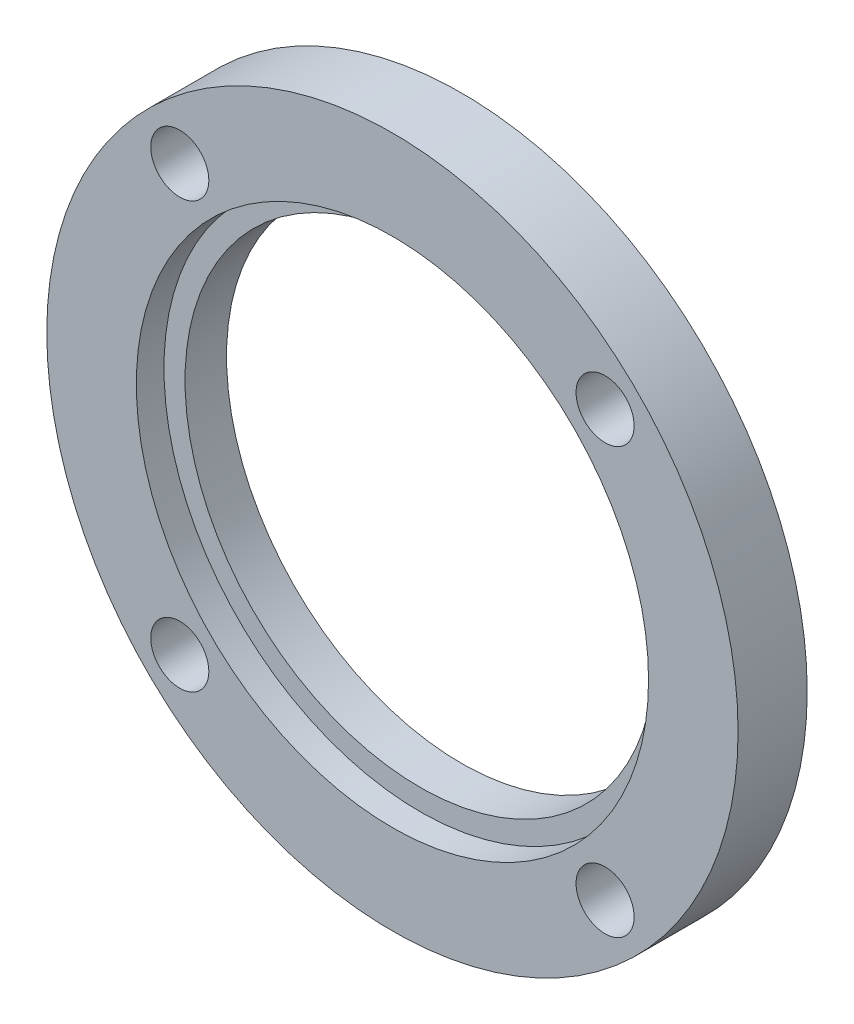
ISO-10303-21;
HEADER;
FILE_DESCRIPTION(('STEP AP214'),'2;1');
FILE_NAME('part.step','',(''),(''),'','','');
FILE_SCHEMA(('AUTOMOTIVE_DESIGN { 1 0 10303 214 1 1 1 1 }'));
ENDSEC;
DATA;
#1=APPLICATION_CONTEXT('core data for automotive mechanical design processes');
#2=APPLICATION_PROTOCOL_DEFINITION('international standard','automotive_design',2000,#1);
#3=PRODUCT_CONTEXT('',#1,'mechanical');
#4=PRODUCT('Part','Part','',(#3));
#5=PRODUCT_RELATED_PRODUCT_CATEGORY('part','',(#4));
#6=PRODUCT_DEFINITION_FORMATION('','',#4);
#7=PRODUCT_DEFINITION_CONTEXT('part definition',#1,'design');
#8=PRODUCT_DEFINITION('design','',#6,#7);
#9=PRODUCT_DEFINITION_SHAPE('','',#8);
#10=(LENGTH_UNIT() NAMED_UNIT(*) SI_UNIT(.MILLI.,.METRE.));
#11=(NAMED_UNIT(*) PLANE_ANGLE_UNIT() SI_UNIT($,.RADIAN.));
#12=(NAMED_UNIT(*) SI_UNIT($,.STERADIAN.) SOLID_ANGLE_UNIT());
#13=UNCERTAINTY_MEASURE_WITH_UNIT(LENGTH_MEASURE(1.E-05),#10,'distance_accuracy_value','');
#14=(GEOMETRIC_REPRESENTATION_CONTEXT(3) GLOBAL_UNCERTAINTY_ASSIGNED_CONTEXT((#13)) GLOBAL_UNIT_ASSIGNED_CONTEXT((#10,
#11,#12)) REPRESENTATION_CONTEXT('',''));
#15=CARTESIAN_POINT('',(0.,0.,0.));
#16=DIRECTION('',(0.,0.,1.));
#17=DIRECTION('',(1.,0.,0.));
#18=AXIS2_PLACEMENT_3D('',#15,#16,#17);
#19=CARTESIAN_POINT('',(0.,0.,5.));
#20=DIRECTION('',(0.,0.,-1.));
#21=DIRECTION('',(-1.,0.,0.));
#22=AXIS2_PLACEMENT_3D('',#19,#20,#21);
#23=CYLINDRICAL_SURFACE('',#22,25.);
#24=CARTESIAN_POINT('',(0.,0.,5.));
#25=DIRECTION('',(0.,0.,1.));
#26=DIRECTION('',(1.,0.,0.));
#27=AXIS2_PLACEMENT_3D('',#24,#25,#26);
#28=CIRCLE('',#27,25.);
#29=CARTESIAN_POINT('',(25.,0.,5.));
#30=VERTEX_POINT('',#29);
#31=EDGE_CURVE('E10',#30,#30,#28,.T.);
#32=ORIENTED_EDGE('',*,*,#31,.F.);
#33=EDGE_LOOP('',(#32));
#34=FACE_BOUND('',#33,.T.);
#35=CARTESIAN_POINT('',(0.,0.,0.));
#36=DIRECTION('',(0.,0.,1.));
#37=DIRECTION('',(1.,0.,0.));
#38=AXIS2_PLACEMENT_3D('',#35,#36,#37);
#39=CIRCLE('',#38,25.);
#40=CARTESIAN_POINT('',(25.,0.,0.));
#41=VERTEX_POINT('',#40);
#42=EDGE_CURVE('E34',#41,#41,#39,.T.);
#43=ORIENTED_EDGE('',*,*,#42,.T.);
#44=EDGE_LOOP('',(#43));
#45=FACE_BOUND('',#44,.T.);
#46=ADVANCED_FACE('F31',(#34,#45),#23,.T.);
#47=CARTESIAN_POINT('',(0.,0.,5.));
#48=DIRECTION('',(0.,0.,1.));
#49=DIRECTION('',(1.,0.,0.));
#50=AXIS2_PLACEMENT_3D('',#47,#48,#49);
#51=PLANE('',#50);
#52=CARTESIAN_POINT('',(-15.3795724908074,15.3795724908074,5.));
#53=DIRECTION('',(0.,0.,1.));
#54=DIRECTION('',(1.,0.,0.));
#55=AXIS2_PLACEMENT_3D('',#52,#53,#54);
#56=CIRCLE('',#55,2.1);
#57=CARTESIAN_POINT('',(-13.2795724908074,15.3795724908074,5.));
#58=VERTEX_POINT('',#57);
#59=EDGE_CURVE('E65',#58,#58,#56,.T.);
#60=ORIENTED_EDGE('',*,*,#59,.F.);
#61=EDGE_LOOP('',(#60));
#62=FACE_BOUND('',#61,.T.);
#63=CARTESIAN_POINT('',(-15.3795724908074,-15.3795724908074,5.));
#64=DIRECTION('',(0.,0.,1.));
#65=DIRECTION('',(1.,0.,0.));
#66=AXIS2_PLACEMENT_3D('',#63,#64,#65);
#67=CIRCLE('',#66,2.1);
#68=CARTESIAN_POINT('',(-13.2795724908074,-15.3795724908074,5.));
#69=VERTEX_POINT('',#68);
#70=EDGE_CURVE('E64',#69,#69,#67,.T.);
#71=ORIENTED_EDGE('',*,*,#70,.F.);
#72=EDGE_LOOP('',(#71));
#73=FACE_BOUND('',#72,.T.);
#74=CARTESIAN_POINT('',(15.3795724908074,-15.3795724908074,5.));
#75=DIRECTION('',(0.,0.,1.));
#76=DIRECTION('',(1.,0.,0.));
#77=AXIS2_PLACEMENT_3D('',#74,#75,#76);
#78=CIRCLE('',#77,2.1);
#79=CARTESIAN_POINT('',(17.4795724908074,-15.3795724908074,5.));
#80=VERTEX_POINT('',#79);
#81=EDGE_CURVE('E71',#80,#80,#78,.T.);
#82=ORIENTED_EDGE('',*,*,#81,.F.);
#83=EDGE_LOOP('',(#82));
#84=FACE_BOUND('',#83,.T.);
#85=CARTESIAN_POINT('',(15.3795724908074,15.3795724908074,5.));
#86=DIRECTION('',(0.,0.,1.));
#87=DIRECTION('',(1.,0.,0.));
#88=AXIS2_PLACEMENT_3D('',#85,#86,#87);
#89=CIRCLE('',#88,2.1);
#90=CARTESIAN_POINT('',(17.4795724908074,15.3795724908074,5.));
#91=VERTEX_POINT('',#90);
#92=EDGE_CURVE('E57',#91,#91,#89,.T.);
#93=ORIENTED_EDGE('',*,*,#92,.F.);
#94=EDGE_LOOP('',(#93));
#95=FACE_BOUND('',#94,.T.);
#96=CARTESIAN_POINT('',(0.,0.,5.));
#97=DIRECTION('',(0.,0.,1.));
#98=DIRECTION('',(1.,0.,0.));
#99=AXIS2_PLACEMENT_3D('',#96,#97,#98);
#100=CIRCLE('',#99,18.525);
#101=CARTESIAN_POINT('',(18.525,0.,5.));
#102=VERTEX_POINT('',#101);
#103=EDGE_CURVE('E43',#102,#102,#100,.T.);
#104=ORIENTED_EDGE('',*,*,#103,.F.);
#105=EDGE_LOOP('',(#104));
#106=FACE_BOUND('',#105,.T.);
#107=ORIENTED_EDGE('',*,*,#31,.T.);
#108=EDGE_LOOP('',(#107));
#109=FACE_BOUND('',#108,.T.);
#110=ADVANCED_FACE('F81',(#62,#73,#84,#95,#106,#109),#51,.T.);
#111=CARTESIAN_POINT('',(0.,0.,0.));
#112=DIRECTION('',(0.,0.,1.));
#113=DIRECTION('',(1.,0.,0.));
#114=AXIS2_PLACEMENT_3D('',#111,#112,#113);
#115=PLANE('',#114);
#116=CARTESIAN_POINT('',(-15.3795724908074,15.3795724908074,0.));
#117=DIRECTION('',(0.,0.,1.));
#118=DIRECTION('',(1.,0.,0.));
#119=AXIS2_PLACEMENT_3D('',#116,#117,#118);
#120=CIRCLE('',#119,2.1);
#121=CARTESIAN_POINT('',(-13.2795724908074,15.3795724908074,0.));
#122=VERTEX_POINT('',#121);
#123=EDGE_CURVE('E61',#122,#122,#120,.F.);
#124=ORIENTED_EDGE('',*,*,#123,.F.);
#125=EDGE_LOOP('',(#124));
#126=FACE_BOUND('',#125,.T.);
#127=CARTESIAN_POINT('',(-15.3795724908074,-15.3795724908074,0.));
#128=DIRECTION('',(0.,0.,1.));
#129=DIRECTION('',(1.,0.,0.));
#130=AXIS2_PLACEMENT_3D('',#127,#128,#129);
#131=CIRCLE('',#130,2.1);
#132=CARTESIAN_POINT('',(-13.2795724908074,-15.3795724908074,0.));
#133=VERTEX_POINT('',#132);
#134=EDGE_CURVE('E68',#133,#133,#131,.F.);
#135=ORIENTED_EDGE('',*,*,#134,.F.);
#136=EDGE_LOOP('',(#135));
#137=FACE_BOUND('',#136,.T.);
#138=CARTESIAN_POINT('',(15.3795724908074,-15.3795724908074,0.));
#139=DIRECTION('',(0.,0.,1.));
#140=DIRECTION('',(1.,0.,0.));
#141=AXIS2_PLACEMENT_3D('',#138,#139,#140);
#142=CIRCLE('',#141,2.1);
#143=CARTESIAN_POINT('',(17.4795724908074,-15.3795724908074,0.));
#144=VERTEX_POINT('',#143);
#145=EDGE_CURVE('E60',#144,#144,#142,.F.);
#146=ORIENTED_EDGE('',*,*,#145,.F.);
#147=EDGE_LOOP('',(#146));
#148=FACE_BOUND('',#147,.T.);
#149=CARTESIAN_POINT('',(15.3795724908074,15.3795724908074,0.));
#150=DIRECTION('',(0.,0.,1.));
#151=DIRECTION('',(1.,0.,0.));
#152=AXIS2_PLACEMENT_3D('',#149,#150,#151);
#153=CIRCLE('',#152,2.1);
#154=CARTESIAN_POINT('',(17.4795724908074,15.3795724908074,0.));
#155=VERTEX_POINT('',#154);
#156=EDGE_CURVE('E54',#155,#155,#153,.F.);
#157=ORIENTED_EDGE('',*,*,#156,.F.);
#158=EDGE_LOOP('',(#157));
#159=FACE_BOUND('',#158,.T.);
#160=CARTESIAN_POINT('',(0.,0.,0.));
#161=DIRECTION('',(0.,0.,1.));
#162=DIRECTION('',(1.,0.,0.));
#163=AXIS2_PLACEMENT_3D('',#160,#161,#162);
#164=CIRCLE('',#163,17.);
#165=CARTESIAN_POINT('',(17.,0.,0.));
#166=VERTEX_POINT('',#165);
#167=EDGE_CURVE('E46',#166,#166,#164,.F.);
#168=ORIENTED_EDGE('',*,*,#167,.F.);
#169=EDGE_LOOP('',(#168));
#170=FACE_BOUND('',#169,.T.);
#171=ORIENTED_EDGE('',*,*,#42,.F.);
#172=EDGE_LOOP('',(#171));
#173=FACE_BOUND('',#172,.T.);
#174=ADVANCED_FACE('F84',(#126,#137,#148,#159,#170,#173),#115,.F.);
#175=CARTESIAN_POINT('',(0.,0.,3.));
#176=DIRECTION('',(0.,0.,1.));
#177=DIRECTION('',(1.,0.,0.));
#178=AXIS2_PLACEMENT_3D('',#175,#176,#177);
#179=CYLINDRICAL_SURFACE('',#178,18.525);
#180=CARTESIAN_POINT('',(0.,0.,3.));
#181=DIRECTION('',(0.,0.,1.));
#182=DIRECTION('',(1.,0.,0.));
#183=AXIS2_PLACEMENT_3D('',#180,#181,#182);
#184=CIRCLE('',#183,18.525);
#185=CARTESIAN_POINT('',(18.525,0.,3.));
#186=VERTEX_POINT('',#185);
#187=EDGE_CURVE('E41',#186,#186,#184,.T.);
#188=ORIENTED_EDGE('',*,*,#187,.F.);
#189=EDGE_LOOP('',(#188));
#190=FACE_BOUND('',#189,.T.);
#191=ORIENTED_EDGE('',*,*,#103,.T.);
#192=EDGE_LOOP('',(#191));
#193=FACE_BOUND('',#192,.T.);
#194=ADVANCED_FACE('F91',(#190,#193),#179,.F.);
#195=CARTESIAN_POINT('',(0.,0.,3.));
#196=DIRECTION('',(0.,0.,1.));
#197=DIRECTION('',(1.,0.,0.));
#198=AXIS2_PLACEMENT_3D('',#195,#196,#197);
#199=PLANE('',#198);
#200=CARTESIAN_POINT('',(0.,0.,3.));
#201=DIRECTION('',(0.,0.,1.));
#202=DIRECTION('',(1.,0.,0.));
#203=AXIS2_PLACEMENT_3D('',#200,#201,#202);
#204=CIRCLE('',#203,17.);
#205=CARTESIAN_POINT('',(17.,0.,3.));
#206=VERTEX_POINT('',#205);
#207=EDGE_CURVE('E51',#206,#206,#204,.T.);
#208=ORIENTED_EDGE('',*,*,#207,.F.);
#209=EDGE_LOOP('',(#208));
#210=FACE_BOUND('',#209,.T.);
#211=ORIENTED_EDGE('',*,*,#187,.T.);
#212=EDGE_LOOP('',(#211));
#213=FACE_BOUND('',#212,.T.);
#214=ADVANCED_FACE('F93',(#210,#213),#199,.T.);
#215=CARTESIAN_POINT('',(0.,0.,-48.0832611206852));
#216=DIRECTION('',(0.,0.,1.));
#217=DIRECTION('',(1.,0.,0.));
#218=AXIS2_PLACEMENT_3D('',#215,#216,#217);
#219=CYLINDRICAL_SURFACE('',#218,17.);
#220=ORIENTED_EDGE('',*,*,#167,.T.);
#221=EDGE_LOOP('',(#220));
#222=FACE_BOUND('',#221,.T.);
#223=ORIENTED_EDGE('',*,*,#207,.T.);
#224=EDGE_LOOP('',(#223));
#225=FACE_BOUND('',#224,.T.);
#226=ADVANCED_FACE('F100',(#222,#225),#219,.F.);
#227=CARTESIAN_POINT('',(15.3795724908074,15.3795724908074,-5.939696961967));
#228=DIRECTION('',(0.,0.,1.));
#229=DIRECTION('',(1.,0.,0.));
#230=AXIS2_PLACEMENT_3D('',#227,#228,#229);
#231=CYLINDRICAL_SURFACE('',#230,2.1);
#232=CARTESIAN_POINT('',(17.4795724908074,15.3795724908074,0.));
#233=CARTESIAN_POINT('',(17.4795724908074,15.3795724908074,0.0520833333333334));
#234=CARTESIAN_POINT('',(17.4795724908074,15.3795724908074,0.104166666666667));
#235=CARTESIAN_POINT('',(17.4795724908074,15.3795724908074,0.208333333333334));
#236=CARTESIAN_POINT('',(17.4795724908074,15.3795724908074,0.260416666666667));
#237=CARTESIAN_POINT('',(17.4795724908074,15.3795724908074,0.364583333333334));
#238=CARTESIAN_POINT('',(17.4795724908074,15.3795724908074,0.416666666666667));
#239=CARTESIAN_POINT('',(17.4795724908074,15.3795724908074,0.520833333333334));
#240=CARTESIAN_POINT('',(17.4795724908074,15.3795724908074,0.572916666666667));
#241=CARTESIAN_POINT('',(17.4795724908074,15.3795724908074,0.677083333333334));
#242=CARTESIAN_POINT('',(17.4795724908074,15.3795724908074,0.729166666666667));
#243=CARTESIAN_POINT('',(17.4795724908074,15.3795724908074,0.833333333333333));
#244=CARTESIAN_POINT('',(17.4795724908074,15.3795724908074,0.885416666666667));
#245=CARTESIAN_POINT('',(17.4795724908074,15.3795724908074,0.989583333333333));
#246=CARTESIAN_POINT('',(17.4795724908074,15.3795724908074,1.04166666666667));
#247=CARTESIAN_POINT('',(17.4795724908074,15.3795724908074,1.14583333333333));
#248=CARTESIAN_POINT('',(17.4795724908074,15.3795724908074,1.19791666666667));
#249=CARTESIAN_POINT('',(17.4795724908074,15.3795724908074,1.30208333333333));
#250=CARTESIAN_POINT('',(17.4795724908074,15.3795724908074,1.35416666666667));
#251=CARTESIAN_POINT('',(17.4795724908074,15.3795724908074,1.45833333333333));
#252=CARTESIAN_POINT('',(17.4795724908074,15.3795724908074,1.51041666666667));
#253=CARTESIAN_POINT('',(17.4795724908074,15.3795724908074,1.61458333333333));
#254=CARTESIAN_POINT('',(17.4795724908074,15.3795724908074,1.66666666666667));
#255=CARTESIAN_POINT('',(17.4795724908074,15.3795724908074,1.77083333333333));
#256=CARTESIAN_POINT('',(17.4795724908074,15.3795724908074,1.82291666666667));
#257=CARTESIAN_POINT('',(17.4795724908074,15.3795724908074,1.92708333333333));
#258=CARTESIAN_POINT('',(17.4795724908074,15.3795724908074,1.97916666666667));
#259=CARTESIAN_POINT('',(17.4795724908074,15.3795724908074,2.08333333333333));
#260=CARTESIAN_POINT('',(17.4795724908074,15.3795724908074,2.13541666666667));
#261=CARTESIAN_POINT('',(17.4795724908074,15.3795724908074,2.23958333333333));
#262=CARTESIAN_POINT('',(17.4795724908074,15.3795724908074,2.29166666666667));
#263=CARTESIAN_POINT('',(17.4795724908074,15.3795724908074,2.39583333333333));
#264=CARTESIAN_POINT('',(17.4795724908074,15.3795724908074,2.44791666666667));
#265=CARTESIAN_POINT('',(17.4795724908074,15.3795724908074,2.55208333333333));
#266=CARTESIAN_POINT('',(17.4795724908074,15.3795724908074,2.60416666666667));
#267=CARTESIAN_POINT('',(17.4795724908074,15.3795724908074,2.70833333333333));
#268=CARTESIAN_POINT('',(17.4795724908074,15.3795724908074,2.76041666666667));
#269=CARTESIAN_POINT('',(17.4795724908074,15.3795724908074,2.86458333333333));
#270=CARTESIAN_POINT('',(17.4795724908074,15.3795724908074,2.91666666666667));
#271=CARTESIAN_POINT('',(17.4795724908074,15.3795724908074,3.02083333333333));
#272=CARTESIAN_POINT('',(17.4795724908074,15.3795724908074,3.07291666666667));
#273=CARTESIAN_POINT('',(17.4795724908074,15.3795724908074,3.17708333333333));
#274=CARTESIAN_POINT('',(17.4795724908074,15.3795724908074,3.22916666666667));
#275=CARTESIAN_POINT('',(17.4795724908074,15.3795724908074,3.33333333333333));
#276=CARTESIAN_POINT('',(17.4795724908074,15.3795724908074,3.38541666666667));
#277=CARTESIAN_POINT('',(17.4795724908074,15.3795724908074,3.48958333333333));
#278=CARTESIAN_POINT('',(17.4795724908074,15.3795724908074,3.54166666666667));
#279=CARTESIAN_POINT('',(17.4795724908074,15.3795724908074,3.64583333333333));
#280=CARTESIAN_POINT('',(17.4795724908074,15.3795724908074,3.69791666666667));
#281=CARTESIAN_POINT('',(17.4795724908074,15.3795724908074,3.80208333333333));
#282=CARTESIAN_POINT('',(17.4795724908074,15.3795724908074,3.85416666666667));
#283=CARTESIAN_POINT('',(17.4795724908074,15.3795724908074,3.95833333333333));
#284=CARTESIAN_POINT('',(17.4795724908074,15.3795724908074,4.01041666666667));
#285=CARTESIAN_POINT('',(17.4795724908074,15.3795724908074,4.11458333333333));
#286=CARTESIAN_POINT('',(17.4795724908074,15.3795724908074,4.16666666666667));
#287=CARTESIAN_POINT('',(17.4795724908074,15.3795724908074,4.27083333333333));
#288=CARTESIAN_POINT('',(17.4795724908074,15.3795724908074,4.32291666666667));
#289=CARTESIAN_POINT('',(17.4795724908074,15.3795724908074,4.42708333333333));
#290=CARTESIAN_POINT('',(17.4795724908074,15.3795724908074,4.47916666666667));
#291=CARTESIAN_POINT('',(17.4795724908074,15.3795724908074,4.58333333333333));
#292=CARTESIAN_POINT('',(17.4795724908074,15.3795724908074,4.63541666666667));
#293=CARTESIAN_POINT('',(17.4795724908074,15.3795724908074,4.73958333333333));
#294=CARTESIAN_POINT('',(17.4795724908074,15.3795724908074,4.79166666666667));
#295=CARTESIAN_POINT('',(17.4795724908074,15.3795724908074,4.89583333333333));
#296=CARTESIAN_POINT('',(17.4795724908074,15.3795724908074,4.94791666666667));
#297=CARTESIAN_POINT('',(17.4795724908074,15.3795724908074,5.));
#298=B_SPLINE_CURVE_WITH_KNOTS('',3,(#232,#233,#234,#235,#236,#237,#238,#239,#240,#241,#242,
#243,#244,#245,#246,#247,#248,#249,#250,#251,#252,#253,#254,#255,#256,#257,#258,#259,#260,#261,
#262,#263,#264,#265,#266,#267,#268,#269,#270,#271,#272,#273,#274,#275,#276,#277,#278,#279,#280,
#281,#282,#283,#284,#285,#286,#287,#288,#289,#290,#291,#292,#293,#294,#295,#296,#297),
.UNSPECIFIED.,.F.,.F.,(4,2,2,2,2,2,2,2,2,2,2,2,2,2,2,2,2,2,2,2,2,2,2,2,2,2,2,2,2,2,2,2,4),(0.,
0.15625,0.3125,0.46875,0.625000000000001,0.78125,0.9375,1.09375,1.25,1.40625,1.5625,1.71875,
1.875,2.03125,2.1875,2.34375,2.5,2.65625,2.8125,2.96875,3.125,3.28125,3.4375,3.59375,3.75,
3.90625,4.0625,4.21875,4.375,4.53125,4.6875,4.84375,5.),.UNSPECIFIED.);
#299=EDGE_CURVE('BSEAM127',#155,#91,#298,.T.);
#300=ORIENTED_EDGE('',*,*,#156,.T.);
#301=ORIENTED_EDGE('',*,*,#92,.T.);
#302=ORIENTED_EDGE('',*,*,#299,.T.);
#303=ORIENTED_EDGE('',*,*,#299,.F.);
#304=EDGE_LOOP('',(#300,#302,#301,#303));
#305=FACE_BOUND('',#304,.T.);
#306=ADVANCED_FACE('F127',(#305),#231,.F.);
#307=CARTESIAN_POINT('',(15.3795724908074,-15.3795724908074,-5.939696961967));
#308=DIRECTION('',(0.,0.,1.));
#309=DIRECTION('',(1.,0.,0.));
#310=AXIS2_PLACEMENT_3D('',#307,#308,#309);
#311=CYLINDRICAL_SURFACE('',#310,2.1);
#312=CARTESIAN_POINT('',(17.4795724908074,-15.3795724908074,0.));
#313=CARTESIAN_POINT('',(17.4795724908074,-15.3795724908074,0.0520833333333334));
#314=CARTESIAN_POINT('',(17.4795724908074,-15.3795724908074,0.104166666666667));
#315=CARTESIAN_POINT('',(17.4795724908074,-15.3795724908074,0.208333333333334));
#316=CARTESIAN_POINT('',(17.4795724908074,-15.3795724908074,0.260416666666667));
#317=CARTESIAN_POINT('',(17.4795724908074,-15.3795724908074,0.364583333333334));
#318=CARTESIAN_POINT('',(17.4795724908074,-15.3795724908074,0.416666666666667));
#319=CARTESIAN_POINT('',(17.4795724908074,-15.3795724908074,0.520833333333334));
#320=CARTESIAN_POINT('',(17.4795724908074,-15.3795724908074,0.572916666666667));
#321=CARTESIAN_POINT('',(17.4795724908074,-15.3795724908074,0.677083333333334));
#322=CARTESIAN_POINT('',(17.4795724908074,-15.3795724908074,0.729166666666667));
#323=CARTESIAN_POINT('',(17.4795724908074,-15.3795724908074,0.833333333333333));
#324=CARTESIAN_POINT('',(17.4795724908074,-15.3795724908074,0.885416666666667));
#325=CARTESIAN_POINT('',(17.4795724908074,-15.3795724908074,0.989583333333333));
#326=CARTESIAN_POINT('',(17.4795724908074,-15.3795724908074,1.04166666666667));
#327=CARTESIAN_POINT('',(17.4795724908074,-15.3795724908074,1.14583333333333));
#328=CARTESIAN_POINT('',(17.4795724908074,-15.3795724908074,1.19791666666667));
#329=CARTESIAN_POINT('',(17.4795724908074,-15.3795724908074,1.30208333333333));
#330=CARTESIAN_POINT('',(17.4795724908074,-15.3795724908074,1.35416666666667));
#331=CARTESIAN_POINT('',(17.4795724908074,-15.3795724908074,1.45833333333333));
#332=CARTESIAN_POINT('',(17.4795724908074,-15.3795724908074,1.51041666666667));
#333=CARTESIAN_POINT('',(17.4795724908074,-15.3795724908074,1.61458333333333));
#334=CARTESIAN_POINT('',(17.4795724908074,-15.3795724908074,1.66666666666667));
#335=CARTESIAN_POINT('',(17.4795724908074,-15.3795724908074,1.77083333333333));
#336=CARTESIAN_POINT('',(17.4795724908074,-15.3795724908074,1.82291666666667));
#337=CARTESIAN_POINT('',(17.4795724908074,-15.3795724908074,1.92708333333333));
#338=CARTESIAN_POINT('',(17.4795724908074,-15.3795724908074,1.97916666666667));
#339=CARTESIAN_POINT('',(17.4795724908074,-15.3795724908074,2.08333333333333));
#340=CARTESIAN_POINT('',(17.4795724908074,-15.3795724908074,2.13541666666667));
#341=CARTESIAN_POINT('',(17.4795724908074,-15.3795724908074,2.23958333333333));
#342=CARTESIAN_POINT('',(17.4795724908074,-15.3795724908074,2.29166666666667));
#343=CARTESIAN_POINT('',(17.4795724908074,-15.3795724908074,2.39583333333333));
#344=CARTESIAN_POINT('',(17.4795724908074,-15.3795724908074,2.44791666666667));
#345=CARTESIAN_POINT('',(17.4795724908074,-15.3795724908074,2.55208333333333));
#346=CARTESIAN_POINT('',(17.4795724908074,-15.3795724908074,2.60416666666667));
#347=CARTESIAN_POINT('',(17.4795724908074,-15.3795724908074,2.70833333333333));
#348=CARTESIAN_POINT('',(17.4795724908074,-15.3795724908074,2.76041666666667));
#349=CARTESIAN_POINT('',(17.4795724908074,-15.3795724908074,2.86458333333333));
#350=CARTESIAN_POINT('',(17.4795724908074,-15.3795724908074,2.91666666666667));
#351=CARTESIAN_POINT('',(17.4795724908074,-15.3795724908074,3.02083333333333));
#352=CARTESIAN_POINT('',(17.4795724908074,-15.3795724908074,3.07291666666667));
#353=CARTESIAN_POINT('',(17.4795724908074,-15.3795724908074,3.17708333333333));
#354=CARTESIAN_POINT('',(17.4795724908074,-15.3795724908074,3.22916666666667));
#355=CARTESIAN_POINT('',(17.4795724908074,-15.3795724908074,3.33333333333333));
#356=CARTESIAN_POINT('',(17.4795724908074,-15.3795724908074,3.38541666666667));
#357=CARTESIAN_POINT('',(17.4795724908074,-15.3795724908074,3.48958333333333));
#358=CARTESIAN_POINT('',(17.4795724908074,-15.3795724908074,3.54166666666667));
#359=CARTESIAN_POINT('',(17.4795724908074,-15.3795724908074,3.64583333333333));
#360=CARTESIAN_POINT('',(17.4795724908074,-15.3795724908074,3.69791666666667));
#361=CARTESIAN_POINT('',(17.4795724908074,-15.3795724908074,3.80208333333333));
#362=CARTESIAN_POINT('',(17.4795724908074,-15.3795724908074,3.85416666666667));
#363=CARTESIAN_POINT('',(17.4795724908074,-15.3795724908074,3.95833333333333));
#364=CARTESIAN_POINT('',(17.4795724908074,-15.3795724908074,4.01041666666667));
#365=CARTESIAN_POINT('',(17.4795724908074,-15.3795724908074,4.11458333333333));
#366=CARTESIAN_POINT('',(17.4795724908074,-15.3795724908074,4.16666666666667));
#367=CARTESIAN_POINT('',(17.4795724908074,-15.3795724908074,4.27083333333333));
#368=CARTESIAN_POINT('',(17.4795724908074,-15.3795724908074,4.32291666666667));
#369=CARTESIAN_POINT('',(17.4795724908074,-15.3795724908074,4.42708333333333));
#370=CARTESIAN_POINT('',(17.4795724908074,-15.3795724908074,4.47916666666667));
#371=CARTESIAN_POINT('',(17.4795724908074,-15.3795724908074,4.58333333333333));
#372=CARTESIAN_POINT('',(17.4795724908074,-15.3795724908074,4.63541666666667));
#373=CARTESIAN_POINT('',(17.4795724908074,-15.3795724908074,4.73958333333333));
#374=CARTESIAN_POINT('',(17.4795724908074,-15.3795724908074,4.79166666666667));
#375=CARTESIAN_POINT('',(17.4795724908074,-15.3795724908074,4.89583333333333));
#376=CARTESIAN_POINT('',(17.4795724908074,-15.3795724908074,4.94791666666667));
#377=CARTESIAN_POINT('',(17.4795724908074,-15.3795724908074,5.));
#378=B_SPLINE_CURVE_WITH_KNOTS('',3,(#312,#313,#314,#315,#316,#317,#318,#319,#320,#321,#322,
#323,#324,#325,#326,#327,#328,#329,#330,#331,#332,#333,#334,#335,#336,#337,#338,#339,#340,#341,
#342,#343,#344,#345,#346,#347,#348,#349,#350,#351,#352,#353,#354,#355,#356,#357,#358,#359,#360,
#361,#362,#363,#364,#365,#366,#367,#368,#369,#370,#371,#372,#373,#374,#375,#376,#377),
.UNSPECIFIED.,.F.,.F.,(4,2,2,2,2,2,2,2,2,2,2,2,2,2,2,2,2,2,2,2,2,2,2,2,2,2,2,2,2,2,2,2,4),(0.,
0.15625,0.3125,0.46875,0.625000000000001,0.78125,0.9375,1.09375,1.25,1.40625,1.5625,1.71875,
1.875,2.03125,2.1875,2.34375,2.5,2.65625,2.8125,2.96875,3.125,3.28125,3.4375,3.59375,3.75,
3.90625,4.0625,4.21875,4.375,4.53125,4.6875,4.84375,5.),.UNSPECIFIED.);
#379=EDGE_CURVE('BSEAM79',#144,#80,#378,.T.);
#380=ORIENTED_EDGE('',*,*,#145,.T.);
#381=ORIENTED_EDGE('',*,*,#81,.T.);
#382=ORIENTED_EDGE('',*,*,#379,.T.);
#383=ORIENTED_EDGE('',*,*,#379,.F.);
#384=EDGE_LOOP('',(#380,#382,#381,#383));
#385=FACE_BOUND('',#384,.T.);
#386=ADVANCED_FACE('F79',(#385),#311,.F.);
#387=CARTESIAN_POINT('',(-15.3795724908074,-15.3795724908074,-5.939696961967));
#388=DIRECTION('',(0.,0.,1.));
#389=DIRECTION('',(1.,0.,0.));
#390=AXIS2_PLACEMENT_3D('',#387,#388,#389);
#391=CYLINDRICAL_SURFACE('',#390,2.1);
#392=CARTESIAN_POINT('',(-13.2795724908074,-15.3795724908074,0.));
#393=CARTESIAN_POINT('',(-13.2795724908074,-15.3795724908074,0.0520833333333334));
#394=CARTESIAN_POINT('',(-13.2795724908074,-15.3795724908074,0.104166666666667));
#395=CARTESIAN_POINT('',(-13.2795724908074,-15.3795724908074,0.208333333333334));
#396=CARTESIAN_POINT('',(-13.2795724908074,-15.3795724908074,0.260416666666667));
#397=CARTESIAN_POINT('',(-13.2795724908074,-15.3795724908074,0.364583333333334));
#398=CARTESIAN_POINT('',(-13.2795724908074,-15.3795724908074,0.416666666666667));
#399=CARTESIAN_POINT('',(-13.2795724908074,-15.3795724908074,0.520833333333334));
#400=CARTESIAN_POINT('',(-13.2795724908074,-15.3795724908074,0.572916666666667));
#401=CARTESIAN_POINT('',(-13.2795724908074,-15.3795724908074,0.677083333333334));
#402=CARTESIAN_POINT('',(-13.2795724908074,-15.3795724908074,0.729166666666667));
#403=CARTESIAN_POINT('',(-13.2795724908074,-15.3795724908074,0.833333333333333));
#404=CARTESIAN_POINT('',(-13.2795724908074,-15.3795724908074,0.885416666666667));
#405=CARTESIAN_POINT('',(-13.2795724908074,-15.3795724908074,0.989583333333333));
#406=CARTESIAN_POINT('',(-13.2795724908074,-15.3795724908074,1.04166666666667));
#407=CARTESIAN_POINT('',(-13.2795724908074,-15.3795724908074,1.14583333333333));
#408=CARTESIAN_POINT('',(-13.2795724908074,-15.3795724908074,1.19791666666667));
#409=CARTESIAN_POINT('',(-13.2795724908074,-15.3795724908074,1.30208333333333));
#410=CARTESIAN_POINT('',(-13.2795724908074,-15.3795724908074,1.35416666666667));
#411=CARTESIAN_POINT('',(-13.2795724908074,-15.3795724908074,1.45833333333333));
#412=CARTESIAN_POINT('',(-13.2795724908074,-15.3795724908074,1.51041666666667));
#413=CARTESIAN_POINT('',(-13.2795724908074,-15.3795724908074,1.61458333333333));
#414=CARTESIAN_POINT('',(-13.2795724908074,-15.3795724908074,1.66666666666667));
#415=CARTESIAN_POINT('',(-13.2795724908074,-15.3795724908074,1.77083333333333));
#416=CARTESIAN_POINT('',(-13.2795724908074,-15.3795724908074,1.82291666666667));
#417=CARTESIAN_POINT('',(-13.2795724908074,-15.3795724908074,1.92708333333333));
#418=CARTESIAN_POINT('',(-13.2795724908074,-15.3795724908074,1.97916666666667));
#419=CARTESIAN_POINT('',(-13.2795724908074,-15.3795724908074,2.08333333333333));
#420=CARTESIAN_POINT('',(-13.2795724908074,-15.3795724908074,2.13541666666667));
#421=CARTESIAN_POINT('',(-13.2795724908074,-15.3795724908074,2.23958333333333));
#422=CARTESIAN_POINT('',(-13.2795724908074,-15.3795724908074,2.29166666666667));
#423=CARTESIAN_POINT('',(-13.2795724908074,-15.3795724908074,2.39583333333333));
#424=CARTESIAN_POINT('',(-13.2795724908074,-15.3795724908074,2.44791666666667));
#425=CARTESIAN_POINT('',(-13.2795724908074,-15.3795724908074,2.55208333333333));
#426=CARTESIAN_POINT('',(-13.2795724908074,-15.3795724908074,2.60416666666667));
#427=CARTESIAN_POINT('',(-13.2795724908074,-15.3795724908074,2.70833333333333));
#428=CARTESIAN_POINT('',(-13.2795724908074,-15.3795724908074,2.76041666666667));
#429=CARTESIAN_POINT('',(-13.2795724908074,-15.3795724908074,2.86458333333333));
#430=CARTESIAN_POINT('',(-13.2795724908074,-15.3795724908074,2.91666666666667));
#431=CARTESIAN_POINT('',(-13.2795724908074,-15.3795724908074,3.02083333333333));
#432=CARTESIAN_POINT('',(-13.2795724908074,-15.3795724908074,3.07291666666667));
#433=CARTESIAN_POINT('',(-13.2795724908074,-15.3795724908074,3.17708333333333));
#434=CARTESIAN_POINT('',(-13.2795724908074,-15.3795724908074,3.22916666666667));
#435=CARTESIAN_POINT('',(-13.2795724908074,-15.3795724908074,3.33333333333333));
#436=CARTESIAN_POINT('',(-13.2795724908074,-15.3795724908074,3.38541666666667));
#437=CARTESIAN_POINT('',(-13.2795724908074,-15.3795724908074,3.48958333333333));
#438=CARTESIAN_POINT('',(-13.2795724908074,-15.3795724908074,3.54166666666667));
#439=CARTESIAN_POINT('',(-13.2795724908074,-15.3795724908074,3.64583333333333));
#440=CARTESIAN_POINT('',(-13.2795724908074,-15.3795724908074,3.69791666666667));
#441=CARTESIAN_POINT('',(-13.2795724908074,-15.3795724908074,3.80208333333333));
#442=CARTESIAN_POINT('',(-13.2795724908074,-15.3795724908074,3.85416666666667));
#443=CARTESIAN_POINT('',(-13.2795724908074,-15.3795724908074,3.95833333333333));
#444=CARTESIAN_POINT('',(-13.2795724908074,-15.3795724908074,4.01041666666667));
#445=CARTESIAN_POINT('',(-13.2795724908074,-15.3795724908074,4.11458333333333));
#446=CARTESIAN_POINT('',(-13.2795724908074,-15.3795724908074,4.16666666666667));
#447=CARTESIAN_POINT('',(-13.2795724908074,-15.3795724908074,4.27083333333333));
#448=CARTESIAN_POINT('',(-13.2795724908074,-15.3795724908074,4.32291666666667));
#449=CARTESIAN_POINT('',(-13.2795724908074,-15.3795724908074,4.42708333333333));
#450=CARTESIAN_POINT('',(-13.2795724908074,-15.3795724908074,4.47916666666667));
#451=CARTESIAN_POINT('',(-13.2795724908074,-15.3795724908074,4.58333333333333));
#452=CARTESIAN_POINT('',(-13.2795724908074,-15.3795724908074,4.63541666666667));
#453=CARTESIAN_POINT('',(-13.2795724908074,-15.3795724908074,4.73958333333333));
#454=CARTESIAN_POINT('',(-13.2795724908074,-15.3795724908074,4.79166666666667));
#455=CARTESIAN_POINT('',(-13.2795724908074,-15.3795724908074,4.89583333333333));
#456=CARTESIAN_POINT('',(-13.2795724908074,-15.3795724908074,4.94791666666667));
#457=CARTESIAN_POINT('',(-13.2795724908074,-15.3795724908074,5.));
#458=B_SPLINE_CURVE_WITH_KNOTS('',3,(#392,#393,#394,#395,#396,#397,#398,#399,#400,#401,#402,
#403,#404,#405,#406,#407,#408,#409,#410,#411,#412,#413,#414,#415,#416,#417,#418,#419,#420,#421,
#422,#423,#424,#425,#426,#427,#428,#429,#430,#431,#432,#433,#434,#435,#436,#437,#438,#439,#440,
#441,#442,#443,#444,#445,#446,#447,#448,#449,#450,#451,#452,#453,#454,#455,#456,#457),
.UNSPECIFIED.,.F.,.F.,(4,2,2,2,2,2,2,2,2,2,2,2,2,2,2,2,2,2,2,2,2,2,2,2,2,2,2,2,2,2,2,2,4),(0.,
0.15625,0.3125,0.46875,0.625000000000001,0.78125,0.9375,1.09375,1.25,1.40625,1.5625,1.71875,
1.875,2.03125,2.1875,2.34375,2.5,2.65625,2.8125,2.96875,3.125,3.28125,3.4375,3.59375,3.75,
3.90625,4.0625,4.21875,4.375,4.53125,4.6875,4.84375,5.),.UNSPECIFIED.);
#459=EDGE_CURVE('BSEAM143',#133,#69,#458,.T.);
#460=ORIENTED_EDGE('',*,*,#134,.T.);
#461=ORIENTED_EDGE('',*,*,#70,.T.);
#462=ORIENTED_EDGE('',*,*,#459,.T.);
#463=ORIENTED_EDGE('',*,*,#459,.F.);
#464=EDGE_LOOP('',(#460,#462,#461,#463));
#465=FACE_BOUND('',#464,.T.);
#466=ADVANCED_FACE('F143',(#465),#391,.F.);
#467=CARTESIAN_POINT('',(-15.3795724908074,15.3795724908074,-5.939696961967));
#468=DIRECTION('',(0.,0.,1.));
#469=DIRECTION('',(1.,0.,0.));
#470=AXIS2_PLACEMENT_3D('',#467,#468,#469);
#471=CYLINDRICAL_SURFACE('',#470,2.1);
#472=CARTESIAN_POINT('',(-13.2795724908074,15.3795724908074,0.));
#473=CARTESIAN_POINT('',(-13.2795724908074,15.3795724908074,0.0520833333333334));
#474=CARTESIAN_POINT('',(-13.2795724908074,15.3795724908074,0.104166666666667));
#475=CARTESIAN_POINT('',(-13.2795724908074,15.3795724908074,0.208333333333334));
#476=CARTESIAN_POINT('',(-13.2795724908074,15.3795724908074,0.260416666666667));
#477=CARTESIAN_POINT('',(-13.2795724908074,15.3795724908074,0.364583333333334));
#478=CARTESIAN_POINT('',(-13.2795724908074,15.3795724908074,0.416666666666667));
#479=CARTESIAN_POINT('',(-13.2795724908074,15.3795724908074,0.520833333333334));
#480=CARTESIAN_POINT('',(-13.2795724908074,15.3795724908074,0.572916666666667));
#481=CARTESIAN_POINT('',(-13.2795724908074,15.3795724908074,0.677083333333334));
#482=CARTESIAN_POINT('',(-13.2795724908074,15.3795724908074,0.729166666666667));
#483=CARTESIAN_POINT('',(-13.2795724908074,15.3795724908074,0.833333333333333));
#484=CARTESIAN_POINT('',(-13.2795724908074,15.3795724908074,0.885416666666667));
#485=CARTESIAN_POINT('',(-13.2795724908074,15.3795724908074,0.989583333333333));
#486=CARTESIAN_POINT('',(-13.2795724908074,15.3795724908074,1.04166666666667));
#487=CARTESIAN_POINT('',(-13.2795724908074,15.3795724908074,1.14583333333333));
#488=CARTESIAN_POINT('',(-13.2795724908074,15.3795724908074,1.19791666666667));
#489=CARTESIAN_POINT('',(-13.2795724908074,15.3795724908074,1.30208333333333));
#490=CARTESIAN_POINT('',(-13.2795724908074,15.3795724908074,1.35416666666667));
#491=CARTESIAN_POINT('',(-13.2795724908074,15.3795724908074,1.45833333333333));
#492=CARTESIAN_POINT('',(-13.2795724908074,15.3795724908074,1.51041666666667));
#493=CARTESIAN_POINT('',(-13.2795724908074,15.3795724908074,1.61458333333333));
#494=CARTESIAN_POINT('',(-13.2795724908074,15.3795724908074,1.66666666666667));
#495=CARTESIAN_POINT('',(-13.2795724908074,15.3795724908074,1.77083333333333));
#496=CARTESIAN_POINT('',(-13.2795724908074,15.3795724908074,1.82291666666667));
#497=CARTESIAN_POINT('',(-13.2795724908074,15.3795724908074,1.92708333333333));
#498=CARTESIAN_POINT('',(-13.2795724908074,15.3795724908074,1.97916666666667));
#499=CARTESIAN_POINT('',(-13.2795724908074,15.3795724908074,2.08333333333333));
#500=CARTESIAN_POINT('',(-13.2795724908074,15.3795724908074,2.13541666666667));
#501=CARTESIAN_POINT('',(-13.2795724908074,15.3795724908074,2.23958333333333));
#502=CARTESIAN_POINT('',(-13.2795724908074,15.3795724908074,2.29166666666667));
#503=CARTESIAN_POINT('',(-13.2795724908074,15.3795724908074,2.39583333333333));
#504=CARTESIAN_POINT('',(-13.2795724908074,15.3795724908074,2.44791666666667));
#505=CARTESIAN_POINT('',(-13.2795724908074,15.3795724908074,2.55208333333333));
#506=CARTESIAN_POINT('',(-13.2795724908074,15.3795724908074,2.60416666666667));
#507=CARTESIAN_POINT('',(-13.2795724908074,15.3795724908074,2.70833333333333));
#508=CARTESIAN_POINT('',(-13.2795724908074,15.3795724908074,2.76041666666667));
#509=CARTESIAN_POINT('',(-13.2795724908074,15.3795724908074,2.86458333333333));
#510=CARTESIAN_POINT('',(-13.2795724908074,15.3795724908074,2.91666666666667));
#511=CARTESIAN_POINT('',(-13.2795724908074,15.3795724908074,3.02083333333333));
#512=CARTESIAN_POINT('',(-13.2795724908074,15.3795724908074,3.07291666666667));
#513=CARTESIAN_POINT('',(-13.2795724908074,15.3795724908074,3.17708333333333));
#514=CARTESIAN_POINT('',(-13.2795724908074,15.3795724908074,3.22916666666667));
#515=CARTESIAN_POINT('',(-13.2795724908074,15.3795724908074,3.33333333333333));
#516=CARTESIAN_POINT('',(-13.2795724908074,15.3795724908074,3.38541666666667));
#517=CARTESIAN_POINT('',(-13.2795724908074,15.3795724908074,3.48958333333333));
#518=CARTESIAN_POINT('',(-13.2795724908074,15.3795724908074,3.54166666666667));
#519=CARTESIAN_POINT('',(-13.2795724908074,15.3795724908074,3.64583333333333));
#520=CARTESIAN_POINT('',(-13.2795724908074,15.3795724908074,3.69791666666667));
#521=CARTESIAN_POINT('',(-13.2795724908074,15.3795724908074,3.80208333333333));
#522=CARTESIAN_POINT('',(-13.2795724908074,15.3795724908074,3.85416666666667));
#523=CARTESIAN_POINT('',(-13.2795724908074,15.3795724908074,3.95833333333333));
#524=CARTESIAN_POINT('',(-13.2795724908074,15.3795724908074,4.01041666666667));
#525=CARTESIAN_POINT('',(-13.2795724908074,15.3795724908074,4.11458333333333));
#526=CARTESIAN_POINT('',(-13.2795724908074,15.3795724908074,4.16666666666667));
#527=CARTESIAN_POINT('',(-13.2795724908074,15.3795724908074,4.27083333333333));
#528=CARTESIAN_POINT('',(-13.2795724908074,15.3795724908074,4.32291666666667));
#529=CARTESIAN_POINT('',(-13.2795724908074,15.3795724908074,4.42708333333333));
#530=CARTESIAN_POINT('',(-13.2795724908074,15.3795724908074,4.47916666666667));
#531=CARTESIAN_POINT('',(-13.2795724908074,15.3795724908074,4.58333333333333));
#532=CARTESIAN_POINT('',(-13.2795724908074,15.3795724908074,4.63541666666667));
#533=CARTESIAN_POINT('',(-13.2795724908074,15.3795724908074,4.73958333333333));
#534=CARTESIAN_POINT('',(-13.2795724908074,15.3795724908074,4.79166666666667));
#535=CARTESIAN_POINT('',(-13.2795724908074,15.3795724908074,4.89583333333333));
#536=CARTESIAN_POINT('',(-13.2795724908074,15.3795724908074,4.94791666666667));
#537=CARTESIAN_POINT('',(-13.2795724908074,15.3795724908074,5.));
#538=B_SPLINE_CURVE_WITH_KNOTS('',3,(#472,#473,#474,#475,#476,#477,#478,#479,#480,#481,#482,
#483,#484,#485,#486,#487,#488,#489,#490,#491,#492,#493,#494,#495,#496,#497,#498,#499,#500,#501,
#502,#503,#504,#505,#506,#507,#508,#509,#510,#511,#512,#513,#514,#515,#516,#517,#518,#519,#520,
#521,#522,#523,#524,#525,#526,#527,#528,#529,#530,#531,#532,#533,#534,#535,#536,#537),
.UNSPECIFIED.,.F.,.F.,(4,2,2,2,2,2,2,2,2,2,2,2,2,2,2,2,2,2,2,2,2,2,2,2,2,2,2,2,2,2,2,2,4),(0.,
0.15625,0.3125,0.46875,0.625000000000001,0.78125,0.9375,1.09375,1.25,1.40625,1.5625,1.71875,
1.875,2.03125,2.1875,2.34375,2.5,2.65625,2.8125,2.96875,3.125,3.28125,3.4375,3.59375,3.75,
3.90625,4.0625,4.21875,4.375,4.53125,4.6875,4.84375,5.),.UNSPECIFIED.);
#539=EDGE_CURVE('BSEAM153',#122,#58,#538,.T.);
#540=ORIENTED_EDGE('',*,*,#123,.T.);
#541=ORIENTED_EDGE('',*,*,#59,.T.);
#542=ORIENTED_EDGE('',*,*,#539,.T.);
#543=ORIENTED_EDGE('',*,*,#539,.F.);
#544=EDGE_LOOP('',(#540,#542,#541,#543));
#545=FACE_BOUND('',#544,.T.);
#546=ADVANCED_FACE('F153',(#545),#471,.F.);
#547=CLOSED_SHELL('',(#46,#110,#174,#194,#214,#226,#306,#386,#466,#546));
#548=MANIFOLD_SOLID_BREP('B2',#547);
#549=ADVANCED_BREP_SHAPE_REPRESENTATION('',(#18,#548),#14);
#550=SHAPE_DEFINITION_REPRESENTATION(#9,#549);
ENDSEC;
END-ISO-10303-21;
